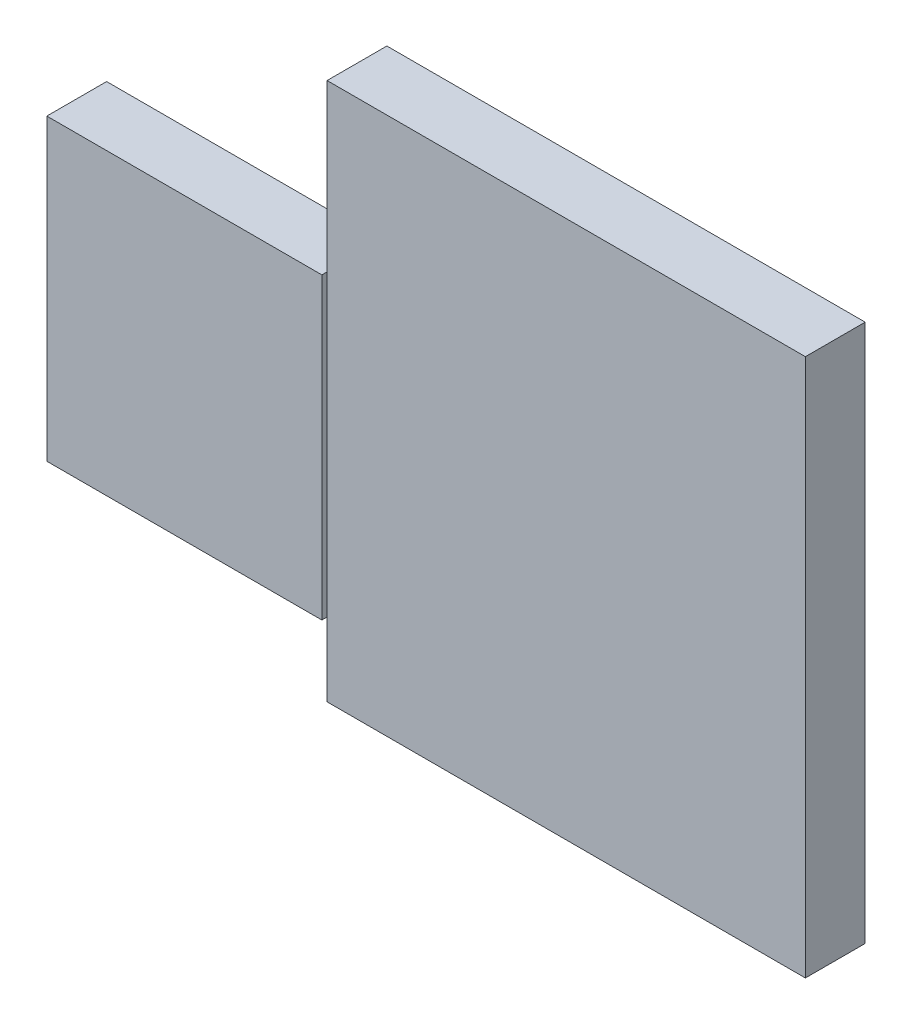
ISO-10303-21;
HEADER;
FILE_DESCRIPTION(('STEP AP214'),'2;1');
FILE_NAME('part.step','',(''),(''),'','','');
FILE_SCHEMA(('AUTOMOTIVE_DESIGN { 1 0 10303 214 1 1 1 1 }'));
ENDSEC;
DATA;
#1=APPLICATION_CONTEXT('core data for automotive mechanical design processes');
#2=APPLICATION_PROTOCOL_DEFINITION('international standard','automotive_design',2000,#1);
#3=PRODUCT_CONTEXT('',#1,'mechanical');
#4=PRODUCT('Part','Part','',(#3));
#5=PRODUCT_RELATED_PRODUCT_CATEGORY('part','',(#4));
#6=PRODUCT_DEFINITION_FORMATION('','',#4);
#7=PRODUCT_DEFINITION_CONTEXT('part definition',#1,'design');
#8=PRODUCT_DEFINITION('design','',#6,#7);
#9=PRODUCT_DEFINITION_SHAPE('','',#8);
#10=(LENGTH_UNIT() NAMED_UNIT(*) SI_UNIT(.MILLI.,.METRE.));
#11=(NAMED_UNIT(*) PLANE_ANGLE_UNIT() SI_UNIT($,.RADIAN.));
#12=(NAMED_UNIT(*) SI_UNIT($,.STERADIAN.) SOLID_ANGLE_UNIT());
#13=UNCERTAINTY_MEASURE_WITH_UNIT(LENGTH_MEASURE(1.E-05),#10,'distance_accuracy_value','');
#14=(GEOMETRIC_REPRESENTATION_CONTEXT(3) GLOBAL_UNCERTAINTY_ASSIGNED_CONTEXT((#13)) GLOBAL_UNIT_ASSIGNED_CONTEXT((#10,
#11,#12)) REPRESENTATION_CONTEXT('',''));
#15=CARTESIAN_POINT('',(0.,0.,0.));
#16=DIRECTION('',(0.,0.,1.));
#17=DIRECTION('',(1.,0.,0.));
#18=AXIS2_PLACEMENT_3D('',#15,#16,#17);
#19=CARTESIAN_POINT('',(-0.437690517336685,-39.2935521026864,5.));
#20=DIRECTION('',(-1.,0.,0.));
#21=DIRECTION('',(0.,0.,1.));
#22=AXIS2_PLACEMENT_3D('',#19,#20,#21);
#23=PLANE('',#22);
#24=DIRECTION('',(0.,1.,0.));
#25=VECTOR('',#24,1.);
#26=CARTESIAN_POINT('',(-0.437690517336685,-39.2935521026864,0.));
#27=LINE('',#26,#25);
#28=CARTESIAN_POINT('',(-0.437690517336685,-39.2935521026864,0.));
#29=VERTEX_POINT('',#28);
#30=CARTESIAN_POINT('',(-0.437690517336685,-14.2935521026864,0.));
#31=VERTEX_POINT('',#30);
#32=EDGE_CURVE('E12',#29,#31,#27,.T.);
#33=ORIENTED_EDGE('',*,*,#32,.T.);
#34=DIRECTION('',(0.,0.,-1.));
#35=VECTOR('',#34,1.);
#36=CARTESIAN_POINT('',(-0.437690517336685,-14.2935521026864,5.));
#37=LINE('',#36,#35);
#38=CARTESIAN_POINT('',(-0.437690517336685,-14.2935521026864,5.));
#39=VERTEX_POINT('',#38);
#40=EDGE_CURVE('E120',#39,#31,#37,.T.);
#41=ORIENTED_EDGE('',*,*,#40,.F.);
#42=DIRECTION('',(0.,1.,0.));
#43=VECTOR('',#42,1.);
#44=CARTESIAN_POINT('',(-0.437690517336685,-39.2935521026864,5.));
#45=LINE('',#44,#43);
#46=CARTESIAN_POINT('',(-0.437690517336685,-39.2935521026864,5.));
#47=VERTEX_POINT('',#46);
#48=EDGE_CURVE('E53',#47,#39,#45,.T.);
#49=ORIENTED_EDGE('',*,*,#48,.F.);
#50=DIRECTION('',(0.,0.,-1.));
#51=VECTOR('',#50,1.);
#52=CARTESIAN_POINT('',(-0.437690517336685,-39.2935521026864,5.));
#53=LINE('',#52,#51);
#54=EDGE_CURVE('E108',#47,#29,#53,.T.);
#55=ORIENTED_EDGE('',*,*,#54,.T.);
#56=EDGE_LOOP('',(#33,#41,#49,#55));
#57=FACE_BOUND('',#56,.T.);
#58=ADVANCED_FACE('F49',(#57),#23,.F.);
#59=CARTESIAN_POINT('',(-0.437690517336685,-14.2935521026864,5.));
#60=DIRECTION('',(0.,-1.,0.));
#61=DIRECTION('',(1.,0.,0.));
#62=AXIS2_PLACEMENT_3D('',#59,#60,#61);
#63=PLANE('',#62);
#64=DIRECTION('',(-1.,0.,0.));
#65=VECTOR('',#64,1.);
#66=CARTESIAN_POINT('',(-0.437690517336685,-14.2935521026864,0.));
#67=LINE('',#66,#65);
#68=CARTESIAN_POINT('',(-23.4376905173367,-14.2935521026864,0.));
#69=VERTEX_POINT('',#68);
#70=EDGE_CURVE('E59',#31,#69,#67,.T.);
#71=ORIENTED_EDGE('',*,*,#70,.T.);
#72=DIRECTION('',(0.,0.,-1.));
#73=VECTOR('',#72,1.);
#74=CARTESIAN_POINT('',(-23.4376905173367,-14.2935521026864,5.));
#75=LINE('',#74,#73);
#76=CARTESIAN_POINT('',(-23.4376905173367,-14.2935521026864,5.));
#77=VERTEX_POINT('',#76);
#78=EDGE_CURVE('E104',#77,#69,#75,.T.);
#79=ORIENTED_EDGE('',*,*,#78,.F.);
#80=DIRECTION('',(-1.,0.,0.));
#81=VECTOR('',#80,1.);
#82=CARTESIAN_POINT('',(-0.437690517336685,-14.2935521026864,5.));
#83=LINE('',#82,#81);
#84=EDGE_CURVE('E83',#39,#77,#83,.T.);
#85=ORIENTED_EDGE('',*,*,#84,.F.);
#86=ORIENTED_EDGE('',*,*,#40,.T.);
#87=EDGE_LOOP('',(#71,#79,#85,#86));
#88=FACE_BOUND('',#87,.T.);
#89=ADVANCED_FACE('F123',(#88),#63,.F.);
#90=CARTESIAN_POINT('',(-23.4376905173367,-39.2935521026864,5.));
#91=DIRECTION('',(1.,0.,0.));
#92=DIRECTION('',(0.,0.,-1.));
#93=AXIS2_PLACEMENT_3D('',#90,#91,#92);
#94=PLANE('',#93);
#95=DIRECTION('',(0.,-1.,0.));
#96=VECTOR('',#95,1.);
#97=CARTESIAN_POINT('',(-23.4376905173367,-39.2935521026864,0.));
#98=LINE('',#97,#96);
#99=CARTESIAN_POINT('',(-23.4376905173367,-39.2935521026864,0.));
#100=VERTEX_POINT('',#99);
#101=EDGE_CURVE('E99',#69,#100,#98,.T.);
#102=ORIENTED_EDGE('',*,*,#101,.T.);
#103=DIRECTION('',(0.,0.,-1.));
#104=VECTOR('',#103,1.);
#105=CARTESIAN_POINT('',(-23.4376905173367,-39.2935521026864,5.));
#106=LINE('',#105,#104);
#107=CARTESIAN_POINT('',(-23.4376905173367,-39.2935521026864,5.));
#108=VERTEX_POINT('',#107);
#109=EDGE_CURVE('E102',#108,#100,#106,.T.);
#110=ORIENTED_EDGE('',*,*,#109,.F.);
#111=DIRECTION('',(0.,-1.,0.));
#112=VECTOR('',#111,1.);
#113=CARTESIAN_POINT('',(-23.4376905173367,-39.2935521026864,5.));
#114=LINE('',#113,#112);
#115=EDGE_CURVE('E116',#77,#108,#114,.T.);
#116=ORIENTED_EDGE('',*,*,#115,.F.);
#117=ORIENTED_EDGE('',*,*,#78,.T.);
#118=EDGE_LOOP('',(#102,#110,#116,#117));
#119=FACE_BOUND('',#118,.T.);
#120=ADVANCED_FACE('F100',(#119),#94,.F.);
#121=CARTESIAN_POINT('',(-0.437690517336685,-39.2935521026864,5.));
#122=DIRECTION('',(0.,1.,0.));
#123=DIRECTION('',(0.,0.,1.));
#124=AXIS2_PLACEMENT_3D('',#121,#122,#123);
#125=PLANE('',#124);
#126=DIRECTION('',(1.,0.,0.));
#127=VECTOR('',#126,1.);
#128=CARTESIAN_POINT('',(-0.437690517336685,-39.2935521026864,0.));
#129=LINE('',#128,#127);
#130=EDGE_CURVE('E93',#100,#29,#129,.T.);
#131=ORIENTED_EDGE('',*,*,#130,.T.);
#132=ORIENTED_EDGE('',*,*,#54,.F.);
#133=DIRECTION('',(1.,0.,0.));
#134=VECTOR('',#133,1.);
#135=CARTESIAN_POINT('',(-0.437690517336685,-39.2935521026864,5.));
#136=LINE('',#135,#134);
#137=EDGE_CURVE('E107',#108,#47,#136,.T.);
#138=ORIENTED_EDGE('',*,*,#137,.F.);
#139=ORIENTED_EDGE('',*,*,#109,.T.);
#140=EDGE_LOOP('',(#131,#132,#138,#139));
#141=FACE_BOUND('',#140,.T.);
#142=ADVANCED_FACE('F106',(#141),#125,.F.);
#143=CARTESIAN_POINT('',(0.,0.,5.));
#144=DIRECTION('',(0.,0.,1.));
#145=DIRECTION('',(1.,0.,0.));
#146=AXIS2_PLACEMENT_3D('',#143,#144,#145);
#147=PLANE('',#146);
#148=ORIENTED_EDGE('',*,*,#48,.T.);
#149=ORIENTED_EDGE('',*,*,#84,.T.);
#150=ORIENTED_EDGE('',*,*,#115,.T.);
#151=ORIENTED_EDGE('',*,*,#137,.T.);
#152=EDGE_LOOP('',(#148,#149,#150,#151));
#153=FACE_BOUND('',#152,.T.);
#154=ADVANCED_FACE('F51',(#153),#147,.T.);
#155=CARTESIAN_POINT('',(0.,0.,0.));
#156=DIRECTION('',(0.,0.,1.));
#157=DIRECTION('',(1.,0.,0.));
#158=AXIS2_PLACEMENT_3D('',#155,#156,#157);
#159=PLANE('',#158);
#160=ORIENTED_EDGE('',*,*,#32,.F.);
#161=ORIENTED_EDGE('',*,*,#130,.F.);
#162=ORIENTED_EDGE('',*,*,#101,.F.);
#163=ORIENTED_EDGE('',*,*,#70,.F.);
#164=EDGE_LOOP('',(#160,#161,#162,#163));
#165=FACE_BOUND('',#164,.T.);
#166=ADVANCED_FACE('F110',(#165),#159,.F.);
#167=CLOSED_SHELL('',(#58,#89,#120,#142,#154,#166));
#168=MANIFOLD_SOLID_BREP('B2',#167);
#169=CARTESIAN_POINT('',(0.,0.,5.));
#170=DIRECTION('',(1.,0.,0.));
#171=DIRECTION('',(0.,1.,0.));
#172=AXIS2_PLACEMENT_3D('',#169,#170,#171);
#173=PLANE('',#172);
#174=DIRECTION('',(0.,-1.,0.));
#175=VECTOR('',#174,1.);
#176=CARTESIAN_POINT('',(0.,0.,0.));
#177=LINE('',#176,#175);
#178=CARTESIAN_POINT('',(0.,0.,0.));
#179=VERTEX_POINT('',#178);
#180=CARTESIAN_POINT('',(0.,-45.,0.));
#181=VERTEX_POINT('',#180);
#182=EDGE_CURVE('E248',#179,#181,#177,.T.);
#183=ORIENTED_EDGE('',*,*,#182,.T.);
#184=DIRECTION('',(0.,0.,-1.));
#185=VECTOR('',#184,1.);
#186=CARTESIAN_POINT('',(0.,-45.,5.));
#187=LINE('',#186,#185);
#188=CARTESIAN_POINT('',(0.,-45.,5.));
#189=VERTEX_POINT('',#188);
#190=EDGE_CURVE('E47',#189,#181,#187,.T.);
#191=ORIENTED_EDGE('',*,*,#190,.F.);
#192=DIRECTION('',(0.,-1.,0.));
#193=VECTOR('',#192,1.);
#194=CARTESIAN_POINT('',(0.,0.,5.));
#195=LINE('',#194,#193);
#196=CARTESIAN_POINT('',(0.,0.,5.));
#197=VERTEX_POINT('',#196);
#198=EDGE_CURVE('E236',#197,#189,#195,.T.);
#199=ORIENTED_EDGE('',*,*,#198,.F.);
#200=DIRECTION('',(0.,0.,-1.));
#201=VECTOR('',#200,1.);
#202=CARTESIAN_POINT('',(0.,0.,5.));
#203=LINE('',#202,#201);
#204=EDGE_CURVE('E244',#197,#179,#203,.T.);
#205=ORIENTED_EDGE('',*,*,#204,.T.);
#206=EDGE_LOOP('',(#183,#191,#199,#205));
#207=FACE_BOUND('',#206,.T.);
#208=ADVANCED_FACE('F185',(#207),#173,.F.);
#209=CARTESIAN_POINT('',(0.,-45.,5.));
#210=DIRECTION('',(0.,1.,0.));
#211=DIRECTION('',(0.,0.,1.));
#212=AXIS2_PLACEMENT_3D('',#209,#210,#211);
#213=PLANE('',#212);
#214=DIRECTION('',(1.,0.,0.));
#215=VECTOR('',#214,1.);
#216=CARTESIAN_POINT('',(0.,-45.,0.));
#217=LINE('',#216,#215);
#218=CARTESIAN_POINT('',(40.,-45.,0.));
#219=VERTEX_POINT('',#218);
#220=EDGE_CURVE('E240',#181,#219,#217,.T.);
#221=ORIENTED_EDGE('',*,*,#220,.T.);
#222=DIRECTION('',(0.,0.,-1.));
#223=VECTOR('',#222,1.);
#224=CARTESIAN_POINT('',(40.,-45.,5.));
#225=LINE('',#224,#223);
#226=CARTESIAN_POINT('',(40.,-45.,5.));
#227=VERTEX_POINT('',#226);
#228=EDGE_CURVE('E193',#227,#219,#225,.T.);
#229=ORIENTED_EDGE('',*,*,#228,.F.);
#230=DIRECTION('',(1.,0.,0.));
#231=VECTOR('',#230,1.);
#232=CARTESIAN_POINT('',(0.,-45.,5.));
#233=LINE('',#232,#231);
#234=EDGE_CURVE('E231',#189,#227,#233,.T.);
#235=ORIENTED_EDGE('',*,*,#234,.F.);
#236=ORIENTED_EDGE('',*,*,#190,.T.);
#237=EDGE_LOOP('',(#221,#229,#235,#236));
#238=FACE_BOUND('',#237,.T.);
#239=ADVANCED_FACE('F239',(#238),#213,.F.);
#240=CARTESIAN_POINT('',(40.,0.,5.));
#241=DIRECTION('',(-1.,0.,0.));
#242=DIRECTION('',(0.,-1.,0.));
#243=AXIS2_PLACEMENT_3D('',#240,#241,#242);
#244=PLANE('',#243);
#245=DIRECTION('',(0.,1.,0.));
#246=VECTOR('',#245,1.);
#247=CARTESIAN_POINT('',(40.,0.,0.));
#248=LINE('',#247,#246);
#249=CARTESIAN_POINT('',(40.,0.,0.));
#250=VERTEX_POINT('',#249);
#251=EDGE_CURVE('E218',#219,#250,#248,.T.);
#252=ORIENTED_EDGE('',*,*,#251,.T.);
#253=DIRECTION('',(0.,0.,-1.));
#254=VECTOR('',#253,1.);
#255=CARTESIAN_POINT('',(40.,0.,5.));
#256=LINE('',#255,#254);
#257=CARTESIAN_POINT('',(40.,0.,5.));
#258=VERTEX_POINT('',#257);
#259=EDGE_CURVE('E241',#258,#250,#256,.T.);
#260=ORIENTED_EDGE('',*,*,#259,.F.);
#261=DIRECTION('',(0.,1.,0.));
#262=VECTOR('',#261,1.);
#263=CARTESIAN_POINT('',(40.,0.,5.));
#264=LINE('',#263,#262);
#265=EDGE_CURVE('E234',#227,#258,#264,.T.);
#266=ORIENTED_EDGE('',*,*,#265,.F.);
#267=ORIENTED_EDGE('',*,*,#228,.T.);
#268=EDGE_LOOP('',(#252,#260,#266,#267));
#269=FACE_BOUND('',#268,.T.);
#270=ADVANCED_FACE('F242',(#269),#244,.F.);
#271=CARTESIAN_POINT('',(0.,0.,5.));
#272=DIRECTION('',(0.,-1.,0.));
#273=DIRECTION('',(0.,0.,-1.));
#274=AXIS2_PLACEMENT_3D('',#271,#272,#273);
#275=PLANE('',#274);
#276=DIRECTION('',(-1.,0.,0.));
#277=VECTOR('',#276,1.);
#278=CARTESIAN_POINT('',(0.,0.,0.));
#279=LINE('',#278,#277);
#280=EDGE_CURVE('E224',#250,#179,#279,.T.);
#281=ORIENTED_EDGE('',*,*,#280,.T.);
#282=ORIENTED_EDGE('',*,*,#204,.F.);
#283=DIRECTION('',(-1.,0.,0.));
#284=VECTOR('',#283,1.);
#285=CARTESIAN_POINT('',(0.,0.,5.));
#286=LINE('',#285,#284);
#287=EDGE_CURVE('E201',#258,#197,#286,.T.);
#288=ORIENTED_EDGE('',*,*,#287,.F.);
#289=ORIENTED_EDGE('',*,*,#259,.T.);
#290=EDGE_LOOP('',(#281,#282,#288,#289));
#291=FACE_BOUND('',#290,.T.);
#292=ADVANCED_FACE('F255',(#291),#275,.F.);
#293=CARTESIAN_POINT('',(0.,0.,5.));
#294=DIRECTION('',(0.,0.,1.));
#295=DIRECTION('',(1.,0.,0.));
#296=AXIS2_PLACEMENT_3D('',#293,#294,#295);
#297=PLANE('',#296);
#298=ORIENTED_EDGE('',*,*,#198,.T.);
#299=ORIENTED_EDGE('',*,*,#234,.T.);
#300=ORIENTED_EDGE('',*,*,#265,.T.);
#301=ORIENTED_EDGE('',*,*,#287,.T.);
#302=EDGE_LOOP('',(#298,#299,#300,#301));
#303=FACE_BOUND('',#302,.T.);
#304=ADVANCED_FACE('F232',(#303),#297,.T.);
#305=CARTESIAN_POINT('',(0.,0.,0.));
#306=DIRECTION('',(0.,0.,1.));
#307=DIRECTION('',(1.,0.,0.));
#308=AXIS2_PLACEMENT_3D('',#305,#306,#307);
#309=PLANE('',#308);
#310=ORIENTED_EDGE('',*,*,#182,.F.);
#311=ORIENTED_EDGE('',*,*,#280,.F.);
#312=ORIENTED_EDGE('',*,*,#251,.F.);
#313=ORIENTED_EDGE('',*,*,#220,.F.);
#314=EDGE_LOOP('',(#310,#311,#312,#313));
#315=FACE_BOUND('',#314,.T.);
#316=ADVANCED_FACE('F258',(#315),#309,.F.);
#317=CLOSED_SHELL('',(#208,#239,#270,#292,#304,#316));
#318=MANIFOLD_SOLID_BREP('B6',#317);
#319=ADVANCED_BREP_SHAPE_REPRESENTATION('',(#18,#168,#318),#14);
#320=SHAPE_DEFINITION_REPRESENTATION(#9,#319);
ENDSEC;
END-ISO-10303-21;
